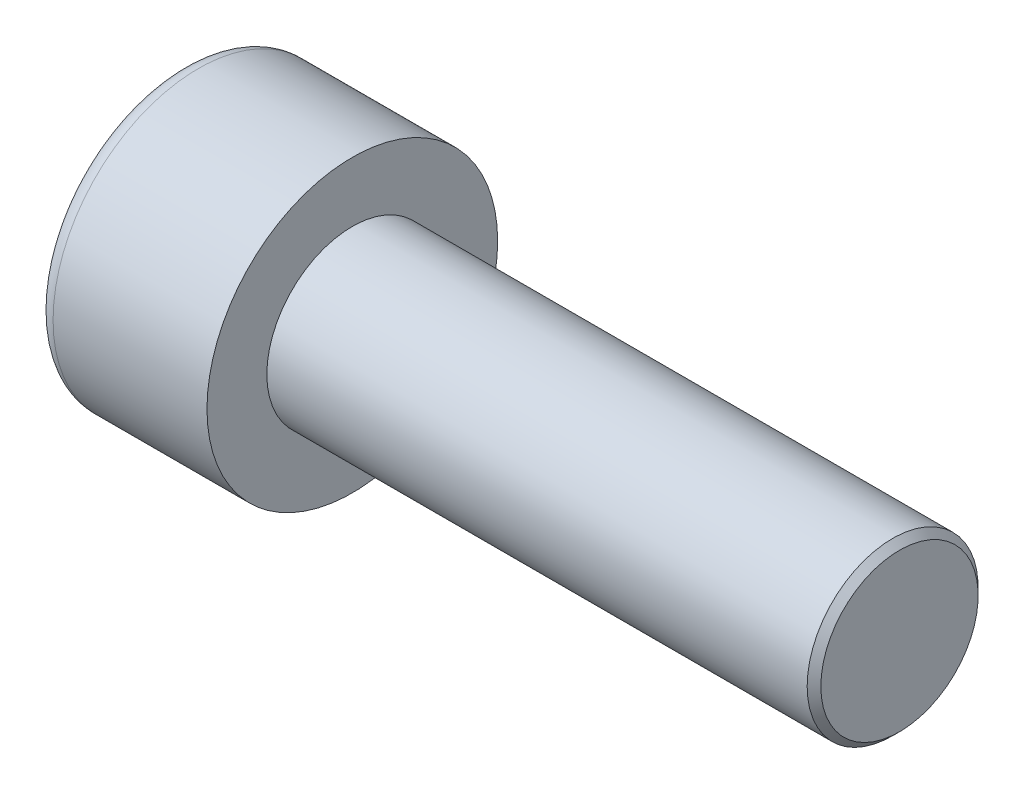
ISO-10303-21;
HEADER;
FILE_DESCRIPTION(('STEP AP214'),'2;1');
FILE_NAME('part.step','',(''),(''),'','','');
FILE_SCHEMA(('AUTOMOTIVE_DESIGN { 1 0 10303 214 1 1 1 1 }'));
ENDSEC;
DATA;
#1=APPLICATION_CONTEXT('core data for automotive mechanical design processes');
#2=APPLICATION_PROTOCOL_DEFINITION('international standard','automotive_design',2000,#1);
#3=PRODUCT_CONTEXT('',#1,'mechanical');
#4=PRODUCT('Part','Part','',(#3));
#5=PRODUCT_RELATED_PRODUCT_CATEGORY('part','',(#4));
#6=PRODUCT_DEFINITION_FORMATION('','',#4);
#7=PRODUCT_DEFINITION_CONTEXT('part definition',#1,'design');
#8=PRODUCT_DEFINITION('design','',#6,#7);
#9=PRODUCT_DEFINITION_SHAPE('','',#8);
#10=(LENGTH_UNIT() NAMED_UNIT(*) SI_UNIT(.MILLI.,.METRE.));
#11=(NAMED_UNIT(*) PLANE_ANGLE_UNIT() SI_UNIT($,.RADIAN.));
#12=(NAMED_UNIT(*) SI_UNIT($,.STERADIAN.) SOLID_ANGLE_UNIT());
#13=UNCERTAINTY_MEASURE_WITH_UNIT(LENGTH_MEASURE(1.E-05),#10,'distance_accuracy_value','');
#14=(GEOMETRIC_REPRESENTATION_CONTEXT(3) GLOBAL_UNCERTAINTY_ASSIGNED_CONTEXT((#13)) GLOBAL_UNIT_ASSIGNED_CONTEXT((#10,
#11,#12)) REPRESENTATION_CONTEXT('',''));
#15=CARTESIAN_POINT('',(0.,0.,0.));
#16=DIRECTION('',(0.,0.,1.));
#17=DIRECTION('',(1.,0.,0.));
#18=AXIS2_PLACEMENT_3D('',#15,#16,#17);
#19=CARTESIAN_POINT('',(0.,0.,0.));
#20=DIRECTION('',(1.,0.,0.));
#21=DIRECTION('',(0.,0.,-1.));
#22=AXIS2_PLACEMENT_3D('',#19,#20,#21);
#23=PLANE('',#22);
#24=DIRECTION('',(0.,0.866025403784439,0.5));
#25=VECTOR('',#24,1.);
#26=CARTESIAN_POINT('',(0.,-2.,1.15470053837925));
#27=LINE('',#26,#25);
#28=CARTESIAN_POINT('',(0.,-2.,1.15470053837925));
#29=VERTEX_POINT('',#28);
#30=CARTESIAN_POINT('',(0.,0.,2.30940107675851));
#31=VERTEX_POINT('',#30);
#32=EDGE_CURVE('E91',#29,#31,#27,.T.);
#33=ORIENTED_EDGE('',*,*,#32,.F.);
#34=DIRECTION('',(0.,0.,1.));
#35=VECTOR('',#34,1.);
#36=CARTESIAN_POINT('',(0.,-2.,-1.15470053837925));
#37=LINE('',#36,#35);
#38=CARTESIAN_POINT('',(0.,-2.,-1.15470053837925));
#39=VERTEX_POINT('',#38);
#40=EDGE_CURVE('E33',#39,#29,#37,.T.);
#41=ORIENTED_EDGE('',*,*,#40,.F.);
#42=DIRECTION('',(0.,-0.866025403784439,0.5));
#43=VECTOR('',#42,1.);
#44=CARTESIAN_POINT('',(0.,0.,-2.30940107675851));
#45=LINE('',#44,#43);
#46=CARTESIAN_POINT('',(0.,0.,-2.30940107675851));
#47=VERTEX_POINT('',#46);
#48=EDGE_CURVE('E106',#47,#39,#45,.T.);
#49=ORIENTED_EDGE('',*,*,#48,.F.);
#50=DIRECTION('',(0.,-0.866025403784439,-0.5));
#51=VECTOR('',#50,1.);
#52=CARTESIAN_POINT('',(0.,2.,-1.15470053837925));
#53=LINE('',#52,#51);
#54=CARTESIAN_POINT('',(0.,2.,-1.15470053837925));
#55=VERTEX_POINT('',#54);
#56=EDGE_CURVE('E100',#55,#47,#53,.T.);
#57=ORIENTED_EDGE('',*,*,#56,.F.);
#58=DIRECTION('',(0.,0.,-1.));
#59=VECTOR('',#58,1.);
#60=CARTESIAN_POINT('',(0.,2.,1.15470053837925));
#61=LINE('',#60,#59);
#62=CARTESIAN_POINT('',(0.,2.,1.15470053837925));
#63=VERTEX_POINT('',#62);
#64=EDGE_CURVE('E98',#63,#55,#61,.T.);
#65=ORIENTED_EDGE('',*,*,#64,.F.);
#66=DIRECTION('',(0.,0.866025403784439,-0.5));
#67=VECTOR('',#66,1.);
#68=CARTESIAN_POINT('',(0.,0.,2.30940107675851));
#69=LINE('',#68,#67);
#70=EDGE_CURVE('E84',#31,#63,#69,.T.);
#71=ORIENTED_EDGE('',*,*,#70,.F.);
#72=EDGE_LOOP('',(#33,#41,#49,#57,#65,#71));
#73=FACE_BOUND('',#72,.T.);
#74=CARTESIAN_POINT('',(0.,0.,0.));
#75=DIRECTION('',(-1.,0.,0.));
#76=DIRECTION('',(0.,0.,1.));
#77=AXIS2_PLACEMENT_3D('',#74,#75,#76);
#78=CIRCLE('',#77,3.75);
#79=CARTESIAN_POINT('',(0.,0.,3.75));
#80=VERTEX_POINT('',#79);
#81=EDGE_CURVE('E12',#80,#80,#78,.T.);
#82=ORIENTED_EDGE('',*,*,#81,.T.);
#83=EDGE_LOOP('',(#82));
#84=FACE_BOUND('',#83,.T.);
#85=ADVANCED_FACE('F19',(#73,#84),#23,.F.);
#86=CARTESIAN_POINT('',(0.5,0.,0.));
#87=DIRECTION('',(-1.,0.,0.));
#88=DIRECTION('',(0.,0.,1.));
#89=AXIS2_PLACEMENT_3D('',#86,#87,#88);
#90=TOROIDAL_SURFACE('',#89,3.75,0.5);
#91=ORIENTED_EDGE('',*,*,#81,.F.);
#92=EDGE_LOOP('',(#91));
#93=FACE_BOUND('',#92,.T.);
#94=CARTESIAN_POINT('',(0.5,0.,0.));
#95=DIRECTION('',(-1.,0.,0.));
#96=DIRECTION('',(0.,0.,1.));
#97=AXIS2_PLACEMENT_3D('',#94,#95,#96);
#98=CIRCLE('',#97,4.25);
#99=CARTESIAN_POINT('',(0.5,0.,4.25));
#100=VERTEX_POINT('',#99);
#101=EDGE_CURVE('E26',#100,#100,#98,.T.);
#102=ORIENTED_EDGE('',*,*,#101,.T.);
#103=EDGE_LOOP('',(#102));
#104=FACE_BOUND('',#103,.T.);
#105=ADVANCED_FACE('F132',(#93,#104),#90,.T.);
#106=CARTESIAN_POINT('',(0.,0.,0.));
#107=DIRECTION('',(-1.,0.,0.));
#108=DIRECTION('',(0.,0.,1.));
#109=AXIS2_PLACEMENT_3D('',#106,#107,#108);
#110=CYLINDRICAL_SURFACE('',#109,4.25);
#111=ORIENTED_EDGE('',*,*,#101,.F.);
#112=EDGE_LOOP('',(#111));
#113=FACE_BOUND('',#112,.T.);
#114=CARTESIAN_POINT('',(5.,0.,0.));
#115=DIRECTION('',(-1.,0.,0.));
#116=DIRECTION('',(0.,0.,1.));
#117=AXIS2_PLACEMENT_3D('',#114,#115,#116);
#118=CIRCLE('',#117,4.25);
#119=CARTESIAN_POINT('',(5.,0.,4.25));
#120=VERTEX_POINT('',#119);
#121=EDGE_CURVE('E127',#120,#120,#118,.T.);
#122=ORIENTED_EDGE('',*,*,#121,.T.);
#123=EDGE_LOOP('',(#122));
#124=FACE_BOUND('',#123,.T.);
#125=ADVANCED_FACE('F134',(#113,#124),#110,.T.);
#126=CARTESIAN_POINT('',(5.,4.25,0.));
#127=DIRECTION('',(-1.,0.,0.));
#128=DIRECTION('',(0.,0.,1.));
#129=AXIS2_PLACEMENT_3D('',#126,#127,#128);
#130=PLANE('',#129);
#131=ORIENTED_EDGE('',*,*,#121,.F.);
#132=EDGE_LOOP('',(#131));
#133=FACE_BOUND('',#132,.T.);
#134=CARTESIAN_POINT('',(5.,0.,0.));
#135=DIRECTION('',(-1.,0.,0.));
#136=DIRECTION('',(0.,0.,1.));
#137=AXIS2_PLACEMENT_3D('',#134,#135,#136);
#138=CIRCLE('',#137,2.5);
#139=CARTESIAN_POINT('',(5.,0.,2.5));
#140=VERTEX_POINT('',#139);
#141=EDGE_CURVE('E124',#140,#140,#138,.T.);
#142=ORIENTED_EDGE('',*,*,#141,.T.);
#143=EDGE_LOOP('',(#142));
#144=FACE_BOUND('',#143,.T.);
#145=ADVANCED_FACE('F137',(#133,#144),#130,.F.);
#146=CARTESIAN_POINT('',(0.,0.,0.));
#147=DIRECTION('',(-1.,0.,0.));
#148=DIRECTION('',(0.,0.,1.));
#149=AXIS2_PLACEMENT_3D('',#146,#147,#148);
#150=CYLINDRICAL_SURFACE('',#149,2.5);
#151=ORIENTED_EDGE('',*,*,#141,.F.);
#152=EDGE_LOOP('',(#151));
#153=FACE_BOUND('',#152,.T.);
#154=CARTESIAN_POINT('',(20.8,0.,0.));
#155=DIRECTION('',(-1.,0.,0.));
#156=DIRECTION('',(0.,0.,1.));
#157=AXIS2_PLACEMENT_3D('',#154,#155,#156);
#158=CIRCLE('',#157,2.5);
#159=CARTESIAN_POINT('',(20.8,0.,2.5));
#160=VERTEX_POINT('',#159);
#161=EDGE_CURVE('E121',#160,#160,#158,.T.);
#162=ORIENTED_EDGE('',*,*,#161,.T.);
#163=EDGE_LOOP('',(#162));
#164=FACE_BOUND('',#163,.T.);
#165=ADVANCED_FACE('F143',(#153,#164),#150,.T.);
#166=CARTESIAN_POINT('',(21.,0.,0.));
#167=DIRECTION('',(-1.,0.,0.));
#168=DIRECTION('',(0.,0.,1.));
#169=AXIS2_PLACEMENT_3D('',#166,#167,#168);
#170=CONICAL_SURFACE('',#169,2.3,0.785398163397452);
#171=ORIENTED_EDGE('',*,*,#161,.F.);
#172=EDGE_LOOP('',(#171));
#173=FACE_BOUND('',#172,.T.);
#174=CARTESIAN_POINT('',(21.,0.,0.));
#175=DIRECTION('',(-1.,0.,0.));
#176=DIRECTION('',(0.,0.,1.));
#177=AXIS2_PLACEMENT_3D('',#174,#175,#176);
#178=CIRCLE('',#177,2.3);
#179=CARTESIAN_POINT('',(21.,0.,2.3));
#180=VERTEX_POINT('',#179);
#181=EDGE_CURVE('E118',#180,#180,#178,.T.);
#182=ORIENTED_EDGE('',*,*,#181,.T.);
#183=EDGE_LOOP('',(#182));
#184=FACE_BOUND('',#183,.T.);
#185=ADVANCED_FACE('F149',(#173,#184),#170,.T.);
#186=CARTESIAN_POINT('',(21.,2.3,0.));
#187=DIRECTION('',(-1.,0.,0.));
#188=DIRECTION('',(0.,0.,1.));
#189=AXIS2_PLACEMENT_3D('',#186,#187,#188);
#190=PLANE('',#189);
#191=ORIENTED_EDGE('',*,*,#181,.F.);
#192=EDGE_LOOP('',(#191));
#193=FACE_BOUND('',#192,.T.);
#194=ADVANCED_FACE('F155',(#193),#190,.F.);
#195=CARTESIAN_POINT('',(11.1101009266078,-2.,-1.15470053837925));
#196=DIRECTION('',(0.,-1.,0.));
#197=DIRECTION('',(0.,0.,-1.));
#198=AXIS2_PLACEMENT_3D('',#195,#196,#197);
#199=PLANE('',#198);
#200=DIRECTION('',(0.,0.,-1.));
#201=VECTOR('',#200,1.);
#202=CARTESIAN_POINT('',(4.5,-2.,-1.15470053837925));
#203=LINE('',#202,#201);
#204=CARTESIAN_POINT('',(4.5,-2.,1.15470053837925));
#205=VERTEX_POINT('',#204);
#206=CARTESIAN_POINT('',(4.5,-2.,-1.15470053837925));
#207=VERTEX_POINT('',#206);
#208=EDGE_CURVE('E52',#205,#207,#203,.T.);
#209=ORIENTED_EDGE('',*,*,#208,.T.);
#210=DIRECTION('',(-1.,0.,0.));
#211=VECTOR('',#210,1.);
#212=CARTESIAN_POINT('',(11.1101009266078,-2.,-1.15470053837925));
#213=LINE('',#212,#211);
#214=EDGE_CURVE('E109',#207,#39,#213,.T.);
#215=ORIENTED_EDGE('',*,*,#214,.T.);
#216=ORIENTED_EDGE('',*,*,#40,.T.);
#217=DIRECTION('',(-1.,0.,0.));
#218=VECTOR('',#217,1.);
#219=CARTESIAN_POINT('',(11.1101009266078,-2.,1.15470053837925));
#220=LINE('',#219,#218);
#221=EDGE_CURVE('E88',#205,#29,#220,.T.);
#222=ORIENTED_EDGE('',*,*,#221,.F.);
#223=EDGE_LOOP('',(#209,#215,#216,#222));
#224=FACE_BOUND('',#223,.T.);
#225=ADVANCED_FACE('F160',(#224),#199,.F.);
#226=CARTESIAN_POINT('',(11.1101009266078,0.,-2.30940107675851));
#227=DIRECTION('',(0.,-0.5,-0.866025403784439));
#228=DIRECTION('',(0.,0.866025403784439,-0.5));
#229=AXIS2_PLACEMENT_3D('',#226,#227,#228);
#230=PLANE('',#229);
#231=DIRECTION('',(0.,0.866025403784439,-0.5));
#232=VECTOR('',#231,1.);
#233=CARTESIAN_POINT('',(4.5,0.,-2.30940107675851));
#234=LINE('',#233,#232);
#235=CARTESIAN_POINT('',(4.5,0.,-2.30940107675851));
#236=VERTEX_POINT('',#235);
#237=EDGE_CURVE('E280',#207,#236,#234,.T.);
#238=ORIENTED_EDGE('',*,*,#237,.T.);
#239=DIRECTION('',(-1.,0.,0.));
#240=VECTOR('',#239,1.);
#241=CARTESIAN_POINT('',(11.1101009266078,0.,-2.30940107675851));
#242=LINE('',#241,#240);
#243=EDGE_CURVE('E111',#236,#47,#242,.T.);
#244=ORIENTED_EDGE('',*,*,#243,.T.);
#245=ORIENTED_EDGE('',*,*,#48,.T.);
#246=ORIENTED_EDGE('',*,*,#214,.F.);
#247=EDGE_LOOP('',(#238,#244,#245,#246));
#248=FACE_BOUND('',#247,.T.);
#249=ADVANCED_FACE('F167',(#248),#230,.F.);
#250=CARTESIAN_POINT('',(11.1101009266078,2.,-1.15470053837925));
#251=DIRECTION('',(0.,0.5,-0.866025403784439));
#252=DIRECTION('',(0.,0.866025403784439,0.5));
#253=AXIS2_PLACEMENT_3D('',#250,#251,#252);
#254=PLANE('',#253);
#255=DIRECTION('',(0.,0.866025403784439,0.5));
#256=VECTOR('',#255,1.);
#257=CARTESIAN_POINT('',(4.5,2.,-1.15470053837925));
#258=LINE('',#257,#256);
#259=CARTESIAN_POINT('',(4.5,2.,-1.15470053837925));
#260=VERTEX_POINT('',#259);
#261=EDGE_CURVE('E283',#236,#260,#258,.T.);
#262=ORIENTED_EDGE('',*,*,#261,.T.);
#263=DIRECTION('',(-1.,0.,0.));
#264=VECTOR('',#263,1.);
#265=CARTESIAN_POINT('',(11.1101009266078,2.,-1.15470053837925));
#266=LINE('',#265,#264);
#267=EDGE_CURVE('E113',#260,#55,#266,.T.);
#268=ORIENTED_EDGE('',*,*,#267,.T.);
#269=ORIENTED_EDGE('',*,*,#56,.T.);
#270=ORIENTED_EDGE('',*,*,#243,.F.);
#271=EDGE_LOOP('',(#262,#268,#269,#270));
#272=FACE_BOUND('',#271,.T.);
#273=ADVANCED_FACE('F231',(#272),#254,.F.);
#274=CARTESIAN_POINT('',(11.1101009266078,2.,1.15470053837925));
#275=DIRECTION('',(0.,1.,0.));
#276=DIRECTION('',(0.,0.,1.));
#277=AXIS2_PLACEMENT_3D('',#274,#275,#276);
#278=PLANE('',#277);
#279=DIRECTION('',(0.,0.,1.));
#280=VECTOR('',#279,1.);
#281=CARTESIAN_POINT('',(4.5,2.,1.15470053837925));
#282=LINE('',#281,#280);
#283=CARTESIAN_POINT('',(4.5,2.,1.15470053837925));
#284=VERTEX_POINT('',#283);
#285=EDGE_CURVE('E42',#260,#284,#282,.T.);
#286=ORIENTED_EDGE('',*,*,#285,.T.);
#287=DIRECTION('',(-1.,0.,0.));
#288=VECTOR('',#287,1.);
#289=CARTESIAN_POINT('',(11.1101009266078,2.,1.15470053837925));
#290=LINE('',#289,#288);
#291=EDGE_CURVE('E87',#284,#63,#290,.T.);
#292=ORIENTED_EDGE('',*,*,#291,.T.);
#293=ORIENTED_EDGE('',*,*,#64,.T.);
#294=ORIENTED_EDGE('',*,*,#267,.F.);
#295=EDGE_LOOP('',(#286,#292,#293,#294));
#296=FACE_BOUND('',#295,.T.);
#297=ADVANCED_FACE('F239',(#296),#278,.F.);
#298=CARTESIAN_POINT('',(11.1101009266078,0.,2.30940107675851));
#299=DIRECTION('',(0.,0.5,0.866025403784439));
#300=DIRECTION('',(0.,-0.866025403784439,0.5));
#301=AXIS2_PLACEMENT_3D('',#298,#299,#300);
#302=PLANE('',#301);
#303=DIRECTION('',(0.,-0.866025403784439,0.5));
#304=VECTOR('',#303,1.);
#305=CARTESIAN_POINT('',(4.5,0.,2.30940107675851));
#306=LINE('',#305,#304);
#307=CARTESIAN_POINT('',(4.5,0.,2.30940107675851));
#308=VERTEX_POINT('',#307);
#309=EDGE_CURVE('E86',#284,#308,#306,.T.);
#310=ORIENTED_EDGE('',*,*,#309,.T.);
#311=DIRECTION('',(-1.,0.,0.));
#312=VECTOR('',#311,1.);
#313=CARTESIAN_POINT('',(11.1101009266078,0.,2.30940107675851));
#314=LINE('',#313,#312);
#315=EDGE_CURVE('E79',#308,#31,#314,.T.);
#316=ORIENTED_EDGE('',*,*,#315,.T.);
#317=ORIENTED_EDGE('',*,*,#70,.T.);
#318=ORIENTED_EDGE('',*,*,#291,.F.);
#319=EDGE_LOOP('',(#310,#316,#317,#318));
#320=FACE_BOUND('',#319,.T.);
#321=ADVANCED_FACE('F81',(#320),#302,.F.);
#322=CARTESIAN_POINT('',(11.1101009266078,-2.,1.15470053837925));
#323=DIRECTION('',(0.,-0.5,0.866025403784439));
#324=DIRECTION('',(0.,-0.866025403784439,-0.5));
#325=AXIS2_PLACEMENT_3D('',#322,#323,#324);
#326=PLANE('',#325);
#327=DIRECTION('',(0.,-0.866025403784439,-0.5));
#328=VECTOR('',#327,1.);
#329=CARTESIAN_POINT('',(4.5,-2.,1.15470053837925));
#330=LINE('',#329,#328);
#331=EDGE_CURVE('E61',#308,#205,#330,.T.);
#332=ORIENTED_EDGE('',*,*,#331,.T.);
#333=ORIENTED_EDGE('',*,*,#221,.T.);
#334=ORIENTED_EDGE('',*,*,#32,.T.);
#335=ORIENTED_EDGE('',*,*,#315,.F.);
#336=EDGE_LOOP('',(#332,#333,#334,#335));
#337=FACE_BOUND('',#336,.T.);
#338=ADVANCED_FACE('F92',(#337),#326,.F.);
#339=CARTESIAN_POINT('',(4.5,4.25,0.));
#340=DIRECTION('',(-1.,0.,0.));
#341=DIRECTION('',(0.,0.,1.));
#342=AXIS2_PLACEMENT_3D('',#339,#340,#341);
#343=PLANE('',#342);
#344=ORIENTED_EDGE('',*,*,#208,.F.);
#345=ORIENTED_EDGE('',*,*,#331,.F.);
#346=ORIENTED_EDGE('',*,*,#309,.F.);
#347=ORIENTED_EDGE('',*,*,#285,.F.);
#348=ORIENTED_EDGE('',*,*,#261,.F.);
#349=ORIENTED_EDGE('',*,*,#237,.F.);
#350=EDGE_LOOP('',(#344,#345,#346,#347,#348,#349));
#351=FACE_BOUND('',#350,.T.);
#352=ADVANCED_FACE('F262',(#351),#343,.T.);
#353=CLOSED_SHELL('',(#85,#105,#125,#145,#165,#185,#194,#225,#249,#273,#297,#321,#338,#352));
#354=MANIFOLD_SOLID_BREP('B1',#353);
#355=ADVANCED_BREP_SHAPE_REPRESENTATION('',(#18,#354),#14);
#356=SHAPE_DEFINITION_REPRESENTATION(#9,#355);
ENDSEC;
END-ISO-10303-21;
